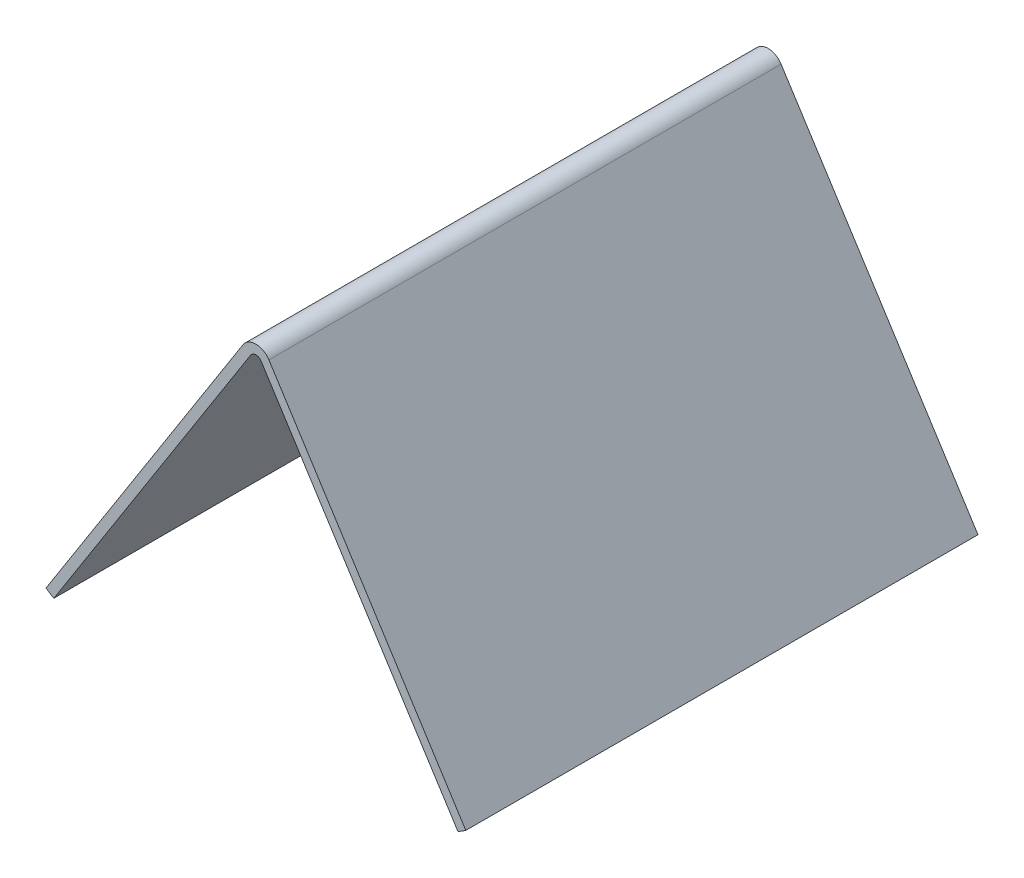
ISO-10303-21;
HEADER;
FILE_DESCRIPTION(('STEP AP214'),'2;1');
FILE_NAME('part.step','',(''),(''),'','','');
FILE_SCHEMA(('AUTOMOTIVE_DESIGN { 1 0 10303 214 1 1 1 1 }'));
ENDSEC;
DATA;
#1=APPLICATION_CONTEXT('core data for automotive mechanical design processes');
#2=APPLICATION_PROTOCOL_DEFINITION('international standard','automotive_design',2000,#1);
#3=PRODUCT_CONTEXT('',#1,'mechanical');
#4=PRODUCT('Part','Part','',(#3));
#5=PRODUCT_RELATED_PRODUCT_CATEGORY('part','',(#4));
#6=PRODUCT_DEFINITION_FORMATION('','',#4);
#7=PRODUCT_DEFINITION_CONTEXT('part definition',#1,'design');
#8=PRODUCT_DEFINITION('design','',#6,#7);
#9=PRODUCT_DEFINITION_SHAPE('','',#8);
#10=(LENGTH_UNIT() NAMED_UNIT(*) SI_UNIT(.MILLI.,.METRE.));
#11=(NAMED_UNIT(*) PLANE_ANGLE_UNIT() SI_UNIT($,.RADIAN.));
#12=(NAMED_UNIT(*) SI_UNIT($,.STERADIAN.) SOLID_ANGLE_UNIT());
#13=UNCERTAINTY_MEASURE_WITH_UNIT(LENGTH_MEASURE(1.E-05),#10,'distance_accuracy_value','');
#14=(GEOMETRIC_REPRESENTATION_CONTEXT(3) GLOBAL_UNCERTAINTY_ASSIGNED_CONTEXT((#13)) GLOBAL_UNIT_ASSIGNED_CONTEXT((#10,
#11,#12)) REPRESENTATION_CONTEXT('',''));
#15=CARTESIAN_POINT('',(0.,0.,0.));
#16=DIRECTION('',(0.,0.,1.));
#17=DIRECTION('',(1.,0.,0.));
#18=AXIS2_PLACEMENT_3D('',#15,#16,#17);
#19=CARTESIAN_POINT('',(0.,108.5,166.));
#20=DIRECTION('',(0.,0.,-1.));
#21=DIRECTION('',(-1.,0.,0.));
#22=AXIS2_PLACEMENT_3D('',#19,#20,#21);
#23=CYLINDRICAL_SURFACE('',#22,5.00000000000014);
#24=CARTESIAN_POINT('',(0.,108.5,0.));
#25=DIRECTION('',(0.,0.,1.));
#26=DIRECTION('',(1.,0.,0.));
#27=AXIS2_PLACEMENT_3D('',#24,#25,#26);
#28=CIRCLE('',#27,5.00000000000014);
#29=CARTESIAN_POINT('',(-4.21695722906457,111.186498041734,0.));
#30=VERTEX_POINT('',#29);
#31=CARTESIAN_POINT('',(4.21695722906461,111.186498041734,0.));
#32=VERTEX_POINT('',#31);
#33=EDGE_CURVE('E130',#30,#32,#28,.F.);
#34=ORIENTED_EDGE('',*,*,#33,.F.);
#35=DIRECTION('',(0.,0.,-1.));
#36=VECTOR('',#35,1.);
#37=CARTESIAN_POINT('',(-4.21695722906457,111.186498041734,166.));
#38=LINE('',#37,#36);
#39=CARTESIAN_POINT('',(-4.21695722906457,111.186498041734,166.));
#40=VERTEX_POINT('',#39);
#41=EDGE_CURVE('E11',#40,#30,#38,.T.);
#42=ORIENTED_EDGE('',*,*,#41,.F.);
#43=CARTESIAN_POINT('',(0.,108.5,166.));
#44=DIRECTION('',(0.,0.,1.));
#45=DIRECTION('',(1.,0.,0.));
#46=AXIS2_PLACEMENT_3D('',#43,#44,#45);
#47=CIRCLE('',#46,5.00000000000014);
#48=CARTESIAN_POINT('',(4.21695722906461,111.186498041734,166.));
#49=VERTEX_POINT('',#48);
#50=EDGE_CURVE('E148',#40,#49,#47,.F.);
#51=ORIENTED_EDGE('',*,*,#50,.T.);
#52=DIRECTION('',(0.,0.,-1.));
#53=VECTOR('',#52,1.);
#54=CARTESIAN_POINT('',(4.21695722906461,111.186498041734,166.));
#55=LINE('',#54,#53);
#56=EDGE_CURVE('E87',#49,#32,#55,.T.);
#57=ORIENTED_EDGE('',*,*,#56,.T.);
#58=EDGE_LOOP('',(#34,#42,#51,#57));
#59=FACE_BOUND('',#58,.T.);
#60=ADVANCED_FACE('F37',(#59),#23,.T.);
#61=CARTESIAN_POINT('',(-53.3841546758025,34.0094573423006,166.));
#62=DIRECTION('',(-0.843391445812889,0.537299608346818,0.));
#63=DIRECTION('',(-0.537299608346818,-0.843391445812889,0.));
#64=AXIS2_PLACEMENT_3D('',#61,#62,#63);
#65=PLANE('',#64);
#66=DIRECTION('',(0.537299608346818,0.843391445812889,0.));
#67=VECTOR('',#66,1.);
#68=CARTESIAN_POINT('',(-53.3841546758025,34.0094573423006,0.));
#69=LINE('',#68,#67);
#70=CARTESIAN_POINT('',(-68.0301743374387,11.0198115172508,0.));
#71=VERTEX_POINT('',#70);
#72=EDGE_CURVE('E133',#71,#30,#69,.T.);
#73=ORIENTED_EDGE('',*,*,#72,.F.);
#74=DIRECTION('',(0.,0.,-1.));
#75=VECTOR('',#74,1.);
#76=CARTESIAN_POINT('',(-68.0301743374387,11.0198115172508,166.));
#77=LINE('',#76,#75);
#78=CARTESIAN_POINT('',(-68.0301743374387,11.0198115172508,166.));
#79=VERTEX_POINT('',#78);
#80=EDGE_CURVE('E45',#79,#71,#77,.T.);
#81=ORIENTED_EDGE('',*,*,#80,.F.);
#82=DIRECTION('',(0.537299608346818,0.843391445812889,0.));
#83=VECTOR('',#82,1.);
#84=CARTESIAN_POINT('',(-53.3841546758025,34.0094573423006,166.));
#85=LINE('',#84,#83);
#86=EDGE_CURVE('E180',#79,#40,#85,.T.);
#87=ORIENTED_EDGE('',*,*,#86,.T.);
#88=ORIENTED_EDGE('',*,*,#41,.T.);
#89=EDGE_LOOP('',(#73,#81,#87,#88));
#90=FACE_BOUND('',#89,.T.);
#91=ADVANCED_FACE('F166',(#90),#65,.T.);
#92=CARTESIAN_POINT('',(-14.6460196616361,-22.9896458250498,166.));
#93=DIRECTION('',(-0.537299608346817,-0.84339144581289,0.));
#94=DIRECTION('',(0.84339144581289,-0.537299608346817,0.));
#95=AXIS2_PLACEMENT_3D('',#92,#93,#94);
#96=PLANE('',#95);
#97=DIRECTION('',(-0.84339144581289,0.537299608346817,0.));
#98=VECTOR('',#97,1.);
#99=CARTESIAN_POINT('',(-14.6460196616361,-22.9896458250498,0.));
#100=LINE('',#99,#98);
#101=CARTESIAN_POINT('',(-65.5,9.40791269221032,0.));
#102=VERTEX_POINT('',#101);
#103=EDGE_CURVE('E136',#102,#71,#100,.T.);
#104=ORIENTED_EDGE('',*,*,#103,.F.);
#105=DIRECTION('',(0.,0.,-1.));
#106=VECTOR('',#105,1.);
#107=CARTESIAN_POINT('',(-65.5,9.40791269221032,166.));
#108=LINE('',#107,#106);
#109=CARTESIAN_POINT('',(-65.5,9.40791269221032,166.));
#110=VERTEX_POINT('',#109);
#111=EDGE_CURVE('E155',#110,#102,#108,.T.);
#112=ORIENTED_EDGE('',*,*,#111,.F.);
#113=DIRECTION('',(-0.84339144581289,0.537299608346817,0.));
#114=VECTOR('',#113,1.);
#115=CARTESIAN_POINT('',(-14.6460196616361,-22.9896458250498,166.));
#116=LINE('',#115,#114);
#117=EDGE_CURVE('E162',#110,#79,#116,.T.);
#118=ORIENTED_EDGE('',*,*,#117,.T.);
#119=ORIENTED_EDGE('',*,*,#80,.T.);
#120=EDGE_LOOP('',(#104,#112,#118,#119));
#121=FACE_BOUND('',#120,.T.);
#122=ADVANCED_FACE('F160',(#121),#96,.T.);
#123=CARTESIAN_POINT('',(-50.8539803383639,32.3975585172601,166.));
#124=DIRECTION('',(-0.843391445812889,0.537299608346818,0.));
#125=DIRECTION('',(-0.537299608346818,-0.843391445812889,0.));
#126=AXIS2_PLACEMENT_3D('',#123,#124,#125);
#127=PLANE('',#126);
#128=DIRECTION('',(0.537299608346818,0.843391445812889,0.));
#129=VECTOR('',#128,1.);
#130=CARTESIAN_POINT('',(-50.8539803383639,32.3975585172601,0.));
#131=LINE('',#130,#129);
#132=CARTESIAN_POINT('',(-1.68678289162591,109.574599216694,0.));
#133=VERTEX_POINT('',#132);
#134=EDGE_CURVE('E139',#102,#133,#131,.T.);
#135=ORIENTED_EDGE('',*,*,#134,.T.);
#136=DIRECTION('',(0.,0.,-1.));
#137=VECTOR('',#136,1.);
#138=CARTESIAN_POINT('',(-1.68678289162591,109.574599216694,166.));
#139=LINE('',#138,#137);
#140=CARTESIAN_POINT('',(-1.68678289162591,109.574599216694,166.));
#141=VERTEX_POINT('',#140);
#142=EDGE_CURVE('E152',#141,#133,#139,.T.);
#143=ORIENTED_EDGE('',*,*,#142,.F.);
#144=DIRECTION('',(0.537299608346818,0.843391445812889,0.));
#145=VECTOR('',#144,1.);
#146=CARTESIAN_POINT('',(-50.8539803383639,32.3975585172601,166.));
#147=LINE('',#146,#145);
#148=EDGE_CURVE('E125',#110,#141,#147,.T.);
#149=ORIENTED_EDGE('',*,*,#148,.F.);
#150=ORIENTED_EDGE('',*,*,#111,.T.);
#151=EDGE_LOOP('',(#135,#143,#149,#150));
#152=FACE_BOUND('',#151,.T.);
#153=ADVANCED_FACE('F173',(#152),#127,.F.);
#154=CARTESIAN_POINT('',(0.,108.5,166.));
#155=DIRECTION('',(0.,0.,-1.));
#156=DIRECTION('',(-1.,0.,0.));
#157=AXIS2_PLACEMENT_3D('',#154,#155,#156);
#158=CYLINDRICAL_SURFACE('',#157,2.00000000000014);
#159=CARTESIAN_POINT('',(0.,108.5,0.));
#160=DIRECTION('',(0.,0.,1.));
#161=DIRECTION('',(1.,0.,0.));
#162=AXIS2_PLACEMENT_3D('',#159,#160,#161);
#163=CIRCLE('',#162,2.00000000000014);
#164=CARTESIAN_POINT('',(1.68678289162594,109.574599216694,0.));
#165=VERTEX_POINT('',#164);
#166=EDGE_CURVE('E141',#133,#165,#163,.F.);
#167=ORIENTED_EDGE('',*,*,#166,.T.);
#168=DIRECTION('',(0.,0.,-1.));
#169=VECTOR('',#168,1.);
#170=CARTESIAN_POINT('',(1.68678289162594,109.574599216694,166.));
#171=LINE('',#170,#169);
#172=CARTESIAN_POINT('',(1.68678289162594,109.574599216694,166.));
#173=VERTEX_POINT('',#172);
#174=EDGE_CURVE('E114',#173,#165,#171,.T.);
#175=ORIENTED_EDGE('',*,*,#174,.F.);
#176=CARTESIAN_POINT('',(0.,108.5,166.));
#177=DIRECTION('',(0.,0.,1.));
#178=DIRECTION('',(1.,0.,0.));
#179=AXIS2_PLACEMENT_3D('',#176,#177,#178);
#180=CIRCLE('',#179,2.00000000000014);
#181=EDGE_CURVE('E122',#141,#173,#180,.F.);
#182=ORIENTED_EDGE('',*,*,#181,.F.);
#183=ORIENTED_EDGE('',*,*,#142,.T.);
#184=EDGE_LOOP('',(#167,#175,#182,#183));
#185=FACE_BOUND('',#184,.T.);
#186=ADVANCED_FACE('F176',(#185),#158,.F.);
#187=CARTESIAN_POINT('',(50.8539803383639,32.3975585172601,166.));
#188=DIRECTION('',(-0.843391445812889,-0.537299608346818,0.));
#189=DIRECTION('',(0.537299608346818,-0.843391445812889,0.));
#190=AXIS2_PLACEMENT_3D('',#187,#188,#189);
#191=PLANE('',#190);
#192=DIRECTION('',(-0.537299608346818,0.843391445812889,0.));
#193=VECTOR('',#192,1.);
#194=CARTESIAN_POINT('',(50.8539803383639,32.3975585172601,0.));
#195=LINE('',#194,#193);
#196=CARTESIAN_POINT('',(65.5,9.40791269221032,0.));
#197=VERTEX_POINT('',#196);
#198=EDGE_CURVE('E113',#197,#165,#195,.T.);
#199=ORIENTED_EDGE('',*,*,#198,.F.);
#200=DIRECTION('',(0.,0.,-1.));
#201=VECTOR('',#200,1.);
#202=CARTESIAN_POINT('',(65.5,9.40791269221032,166.));
#203=LINE('',#202,#201);
#204=CARTESIAN_POINT('',(65.5,9.40791269221032,166.));
#205=VERTEX_POINT('',#204);
#206=EDGE_CURVE('E107',#205,#197,#203,.T.);
#207=ORIENTED_EDGE('',*,*,#206,.F.);
#208=DIRECTION('',(-0.537299608346818,0.843391445812889,0.));
#209=VECTOR('',#208,1.);
#210=CARTESIAN_POINT('',(50.8539803383639,32.3975585172601,166.));
#211=LINE('',#210,#209);
#212=EDGE_CURVE('E111',#205,#173,#211,.T.);
#213=ORIENTED_EDGE('',*,*,#212,.T.);
#214=ORIENTED_EDGE('',*,*,#174,.T.);
#215=EDGE_LOOP('',(#199,#207,#213,#214));
#216=FACE_BOUND('',#215,.T.);
#217=ADVANCED_FACE('F109',(#216),#191,.T.);
#218=CARTESIAN_POINT('',(14.6460196616361,-22.9896458250498,166.));
#219=DIRECTION('',(-0.537299608346817,0.84339144581289,0.));
#220=DIRECTION('',(-0.84339144581289,-0.537299608346817,0.));
#221=AXIS2_PLACEMENT_3D('',#218,#219,#220);
#222=PLANE('',#221);
#223=DIRECTION('',(0.84339144581289,0.537299608346817,0.));
#224=VECTOR('',#223,1.);
#225=CARTESIAN_POINT('',(14.6460196616361,-22.9896458250498,0.));
#226=LINE('',#225,#224);
#227=CARTESIAN_POINT('',(68.0301743374387,11.0198115172508,0.));
#228=VERTEX_POINT('',#227);
#229=EDGE_CURVE('E80',#197,#228,#226,.T.);
#230=ORIENTED_EDGE('',*,*,#229,.T.);
#231=DIRECTION('',(0.,0.,-1.));
#232=VECTOR('',#231,1.);
#233=CARTESIAN_POINT('',(68.0301743374387,11.0198115172508,166.));
#234=LINE('',#233,#232);
#235=CARTESIAN_POINT('',(68.0301743374387,11.0198115172508,166.));
#236=VERTEX_POINT('',#235);
#237=EDGE_CURVE('E115',#236,#228,#234,.T.);
#238=ORIENTED_EDGE('',*,*,#237,.F.);
#239=DIRECTION('',(0.84339144581289,0.537299608346817,0.));
#240=VECTOR('',#239,1.);
#241=CARTESIAN_POINT('',(14.6460196616361,-22.9896458250498,166.));
#242=LINE('',#241,#240);
#243=EDGE_CURVE('E117',#205,#236,#242,.T.);
#244=ORIENTED_EDGE('',*,*,#243,.F.);
#245=ORIENTED_EDGE('',*,*,#206,.T.);
#246=EDGE_LOOP('',(#230,#238,#244,#245));
#247=FACE_BOUND('',#246,.T.);
#248=ADVANCED_FACE('F118',(#247),#222,.F.);
#249=CARTESIAN_POINT('',(53.3841546758026,34.0094573423006,166.));
#250=DIRECTION('',(-0.843391445812889,-0.537299608346818,0.));
#251=DIRECTION('',(0.537299608346818,-0.843391445812889,0.));
#252=AXIS2_PLACEMENT_3D('',#249,#250,#251);
#253=PLANE('',#252);
#254=DIRECTION('',(-0.537299608346818,0.843391445812889,0.));
#255=VECTOR('',#254,1.);
#256=CARTESIAN_POINT('',(53.3841546758026,34.0094573423006,0.));
#257=LINE('',#256,#255);
#258=EDGE_CURVE('E146',#228,#32,#257,.T.);
#259=ORIENTED_EDGE('',*,*,#258,.T.);
#260=ORIENTED_EDGE('',*,*,#56,.F.);
#261=DIRECTION('',(-0.537299608346818,0.843391445812889,0.));
#262=VECTOR('',#261,1.);
#263=CARTESIAN_POINT('',(53.3841546758026,34.0094573423006,166.));
#264=LINE('',#263,#262);
#265=EDGE_CURVE('E53',#236,#49,#264,.T.);
#266=ORIENTED_EDGE('',*,*,#265,.F.);
#267=ORIENTED_EDGE('',*,*,#237,.T.);
#268=EDGE_LOOP('',(#259,#260,#266,#267));
#269=FACE_BOUND('',#268,.T.);
#270=ADVANCED_FACE('F179',(#269),#253,.F.);
#271=CARTESIAN_POINT('',(0.,0.,166.));
#272=DIRECTION('',(0.,0.,1.));
#273=DIRECTION('',(1.,0.,0.));
#274=AXIS2_PLACEMENT_3D('',#271,#272,#273);
#275=PLANE('',#274);
#276=ORIENTED_EDGE('',*,*,#50,.F.);
#277=ORIENTED_EDGE('',*,*,#86,.F.);
#278=ORIENTED_EDGE('',*,*,#117,.F.);
#279=ORIENTED_EDGE('',*,*,#148,.T.);
#280=ORIENTED_EDGE('',*,*,#181,.T.);
#281=ORIENTED_EDGE('',*,*,#212,.F.);
#282=ORIENTED_EDGE('',*,*,#243,.T.);
#283=ORIENTED_EDGE('',*,*,#265,.T.);
#284=EDGE_LOOP('',(#276,#277,#278,#279,#280,#281,#282,#283));
#285=FACE_BOUND('',#284,.T.);
#286=ADVANCED_FACE('F120',(#285),#275,.T.);
#287=CARTESIAN_POINT('',(0.,0.,0.));
#288=DIRECTION('',(0.,0.,1.));
#289=DIRECTION('',(1.,0.,0.));
#290=AXIS2_PLACEMENT_3D('',#287,#288,#289);
#291=PLANE('',#290);
#292=ORIENTED_EDGE('',*,*,#33,.T.);
#293=ORIENTED_EDGE('',*,*,#258,.F.);
#294=ORIENTED_EDGE('',*,*,#229,.F.);
#295=ORIENTED_EDGE('',*,*,#198,.T.);
#296=ORIENTED_EDGE('',*,*,#166,.F.);
#297=ORIENTED_EDGE('',*,*,#134,.F.);
#298=ORIENTED_EDGE('',*,*,#103,.T.);
#299=ORIENTED_EDGE('',*,*,#72,.T.);
#300=EDGE_LOOP('',(#292,#293,#294,#295,#296,#297,#298,#299));
#301=FACE_BOUND('',#300,.T.);
#302=ADVANCED_FACE('F169',(#301),#291,.F.);
#303=CLOSED_SHELL('',(#60,#91,#122,#153,#186,#217,#248,#270,#286,#302));
#304=MANIFOLD_SOLID_BREP('B2',#303);
#305=ADVANCED_BREP_SHAPE_REPRESENTATION('',(#18,#304),#14);
#306=SHAPE_DEFINITION_REPRESENTATION(#9,#305);
ENDSEC;
END-ISO-10303-21;
